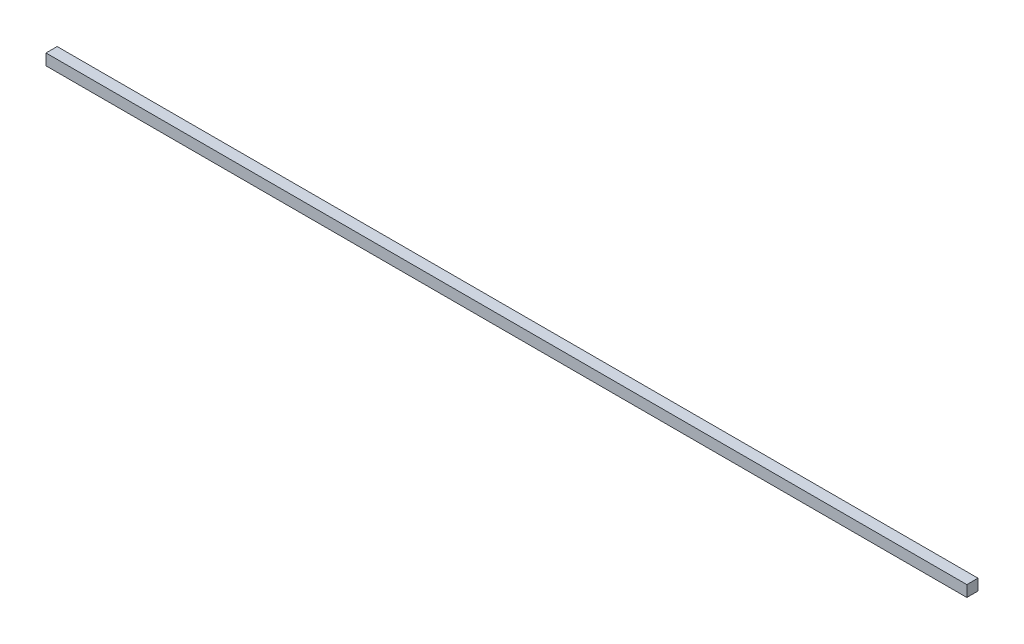
ISO-10303-21;
HEADER;
FILE_DESCRIPTION(('STEP AP214'),'2;1');
FILE_NAME('part.step','',(''),(''),'','','');
FILE_SCHEMA(('AUTOMOTIVE_DESIGN { 1 0 10303 214 1 1 1 1 }'));
ENDSEC;
DATA;
#1=APPLICATION_CONTEXT('core data for automotive mechanical design processes');
#2=APPLICATION_PROTOCOL_DEFINITION('international standard','automotive_design',2000,#1);
#3=PRODUCT_CONTEXT('',#1,'mechanical');
#4=PRODUCT('Part','Part','',(#3));
#5=PRODUCT_RELATED_PRODUCT_CATEGORY('part','',(#4));
#6=PRODUCT_DEFINITION_FORMATION('','',#4);
#7=PRODUCT_DEFINITION_CONTEXT('part definition',#1,'design');
#8=PRODUCT_DEFINITION('design','',#6,#7);
#9=PRODUCT_DEFINITION_SHAPE('','',#8);
#10=(LENGTH_UNIT() NAMED_UNIT(*) SI_UNIT(.MILLI.,.METRE.));
#11=(NAMED_UNIT(*) PLANE_ANGLE_UNIT() SI_UNIT($,.RADIAN.));
#12=(NAMED_UNIT(*) SI_UNIT($,.STERADIAN.) SOLID_ANGLE_UNIT());
#13=UNCERTAINTY_MEASURE_WITH_UNIT(LENGTH_MEASURE(1.E-05),#10,'distance_accuracy_value','');
#14=(GEOMETRIC_REPRESENTATION_CONTEXT(3) GLOBAL_UNCERTAINTY_ASSIGNED_CONTEXT((#13)) GLOBAL_UNIT_ASSIGNED_CONTEXT((#10,
#11,#12)) REPRESENTATION_CONTEXT('',''));
#15=CARTESIAN_POINT('',(0.,0.,0.));
#16=DIRECTION('',(0.,0.,1.));
#17=DIRECTION('',(1.,0.,0.));
#18=AXIS2_PLACEMENT_3D('',#15,#16,#17);
#19=CARTESIAN_POINT('',(20.,1562.,30.));
#20=DIRECTION('',(1.,0.,0.));
#21=DIRECTION('',(0.,0.,-1.));
#22=AXIS2_PLACEMENT_3D('',#19,#20,#21);
#23=PLANE('',#22);
#24=DIRECTION('',(0.,-1.,0.));
#25=VECTOR('',#24,1.);
#26=CARTESIAN_POINT('',(20.,1562.,22.));
#27=LINE('',#26,#25);
#28=CARTESIAN_POINT('',(20.,1570.,22.));
#29=VERTEX_POINT('',#28);
#30=CARTESIAN_POINT('',(20.,1562.,22.));
#31=VERTEX_POINT('',#30);
#32=EDGE_CURVE('E102',#29,#31,#27,.T.);
#33=ORIENTED_EDGE('',*,*,#32,.T.);
#34=DIRECTION('',(0.,0.,-1.));
#35=VECTOR('',#34,1.);
#36=CARTESIAN_POINT('',(20.,1562.,30.));
#37=LINE('',#36,#35);
#38=CARTESIAN_POINT('',(20.,1562.,30.));
#39=VERTEX_POINT('',#38);
#40=EDGE_CURVE('E11',#39,#31,#37,.T.);
#41=ORIENTED_EDGE('',*,*,#40,.F.);
#42=DIRECTION('',(0.,-1.,0.));
#43=VECTOR('',#42,1.);
#44=CARTESIAN_POINT('',(20.,1562.,30.));
#45=LINE('',#44,#43);
#46=CARTESIAN_POINT('',(20.,1570.,30.));
#47=VERTEX_POINT('',#46);
#48=EDGE_CURVE('E90',#47,#39,#45,.T.);
#49=ORIENTED_EDGE('',*,*,#48,.F.);
#50=DIRECTION('',(0.,0.,-1.));
#51=VECTOR('',#50,1.);
#52=CARTESIAN_POINT('',(20.,1570.,30.));
#53=LINE('',#52,#51);
#54=EDGE_CURVE('E98',#47,#29,#53,.T.);
#55=ORIENTED_EDGE('',*,*,#54,.T.);
#56=EDGE_LOOP('',(#33,#41,#49,#55));
#57=FACE_BOUND('',#56,.T.);
#58=ADVANCED_FACE('F39',(#57),#23,.F.);
#59=CARTESIAN_POINT('',(20.,1562.,30.));
#60=DIRECTION('',(0.,1.,0.));
#61=DIRECTION('',(0.,0.,1.));
#62=AXIS2_PLACEMENT_3D('',#59,#60,#61);
#63=PLANE('',#62);
#64=DIRECTION('',(1.,0.,0.));
#65=VECTOR('',#64,1.);
#66=CARTESIAN_POINT('',(20.,1562.,22.));
#67=LINE('',#66,#65);
#68=CARTESIAN_POINT('',(680.,1562.,22.));
#69=VERTEX_POINT('',#68);
#70=EDGE_CURVE('E94',#31,#69,#67,.T.);
#71=ORIENTED_EDGE('',*,*,#70,.T.);
#72=DIRECTION('',(0.,0.,-1.));
#73=VECTOR('',#72,1.);
#74=CARTESIAN_POINT('',(680.,1562.,30.));
#75=LINE('',#74,#73);
#76=CARTESIAN_POINT('',(680.,1562.,30.));
#77=VERTEX_POINT('',#76);
#78=EDGE_CURVE('E47',#77,#69,#75,.T.);
#79=ORIENTED_EDGE('',*,*,#78,.F.);
#80=DIRECTION('',(1.,0.,0.));
#81=VECTOR('',#80,1.);
#82=CARTESIAN_POINT('',(20.,1562.,30.));
#83=LINE('',#82,#81);
#84=EDGE_CURVE('E85',#39,#77,#83,.T.);
#85=ORIENTED_EDGE('',*,*,#84,.F.);
#86=ORIENTED_EDGE('',*,*,#40,.T.);
#87=EDGE_LOOP('',(#71,#79,#85,#86));
#88=FACE_BOUND('',#87,.T.);
#89=ADVANCED_FACE('F93',(#88),#63,.F.);
#90=CARTESIAN_POINT('',(680.,1562.,30.));
#91=DIRECTION('',(-1.,0.,0.));
#92=DIRECTION('',(0.,0.,1.));
#93=AXIS2_PLACEMENT_3D('',#90,#91,#92);
#94=PLANE('',#93);
#95=DIRECTION('',(0.,1.,0.));
#96=VECTOR('',#95,1.);
#97=CARTESIAN_POINT('',(680.,1562.,22.));
#98=LINE('',#97,#96);
#99=CARTESIAN_POINT('',(680.,1570.,22.));
#100=VERTEX_POINT('',#99);
#101=EDGE_CURVE('E72',#69,#100,#98,.T.);
#102=ORIENTED_EDGE('',*,*,#101,.T.);
#103=DIRECTION('',(0.,0.,-1.));
#104=VECTOR('',#103,1.);
#105=CARTESIAN_POINT('',(680.,1570.,30.));
#106=LINE('',#105,#104);
#107=CARTESIAN_POINT('',(680.,1570.,30.));
#108=VERTEX_POINT('',#107);
#109=EDGE_CURVE('E95',#108,#100,#106,.T.);
#110=ORIENTED_EDGE('',*,*,#109,.F.);
#111=DIRECTION('',(0.,1.,0.));
#112=VECTOR('',#111,1.);
#113=CARTESIAN_POINT('',(680.,1562.,30.));
#114=LINE('',#113,#112);
#115=EDGE_CURVE('E88',#77,#108,#114,.T.);
#116=ORIENTED_EDGE('',*,*,#115,.F.);
#117=ORIENTED_EDGE('',*,*,#78,.T.);
#118=EDGE_LOOP('',(#102,#110,#116,#117));
#119=FACE_BOUND('',#118,.T.);
#120=ADVANCED_FACE('F96',(#119),#94,.F.);
#121=CARTESIAN_POINT('',(20.,1570.,30.));
#122=DIRECTION('',(0.,-1.,0.));
#123=DIRECTION('',(0.,0.,-1.));
#124=AXIS2_PLACEMENT_3D('',#121,#122,#123);
#125=PLANE('',#124);
#126=DIRECTION('',(-1.,0.,0.));
#127=VECTOR('',#126,1.);
#128=CARTESIAN_POINT('',(20.,1570.,22.));
#129=LINE('',#128,#127);
#130=EDGE_CURVE('E78',#100,#29,#129,.T.);
#131=ORIENTED_EDGE('',*,*,#130,.T.);
#132=ORIENTED_EDGE('',*,*,#54,.F.);
#133=DIRECTION('',(-1.,0.,0.));
#134=VECTOR('',#133,1.);
#135=CARTESIAN_POINT('',(20.,1570.,30.));
#136=LINE('',#135,#134);
#137=EDGE_CURVE('E55',#108,#47,#136,.T.);
#138=ORIENTED_EDGE('',*,*,#137,.F.);
#139=ORIENTED_EDGE('',*,*,#109,.T.);
#140=EDGE_LOOP('',(#131,#132,#138,#139));
#141=FACE_BOUND('',#140,.T.);
#142=ADVANCED_FACE('F109',(#141),#125,.F.);
#143=CARTESIAN_POINT('',(0.,0.,30.));
#144=DIRECTION('',(0.,0.,-1.));
#145=DIRECTION('',(-1.,0.,0.));
#146=AXIS2_PLACEMENT_3D('',#143,#144,#145);
#147=PLANE('',#146);
#148=ORIENTED_EDGE('',*,*,#48,.T.);
#149=ORIENTED_EDGE('',*,*,#84,.T.);
#150=ORIENTED_EDGE('',*,*,#115,.T.);
#151=ORIENTED_EDGE('',*,*,#137,.T.);
#152=EDGE_LOOP('',(#148,#149,#150,#151));
#153=FACE_BOUND('',#152,.T.);
#154=ADVANCED_FACE('F86',(#153),#147,.F.);
#155=CARTESIAN_POINT('',(0.,0.,22.));
#156=DIRECTION('',(0.,0.,-1.));
#157=DIRECTION('',(-1.,0.,0.));
#158=AXIS2_PLACEMENT_3D('',#155,#156,#157);
#159=PLANE('',#158);
#160=ORIENTED_EDGE('',*,*,#32,.F.);
#161=ORIENTED_EDGE('',*,*,#130,.F.);
#162=ORIENTED_EDGE('',*,*,#101,.F.);
#163=ORIENTED_EDGE('',*,*,#70,.F.);
#164=EDGE_LOOP('',(#160,#161,#162,#163));
#165=FACE_BOUND('',#164,.T.);
#166=ADVANCED_FACE('F112',(#165),#159,.T.);
#167=CLOSED_SHELL('',(#58,#89,#120,#142,#154,#166));
#168=MANIFOLD_SOLID_BREP('B2',#167);
#169=ADVANCED_BREP_SHAPE_REPRESENTATION('',(#18,#168),#14);
#170=SHAPE_DEFINITION_REPRESENTATION(#9,#169);
ENDSEC;
END-ISO-10303-21;
